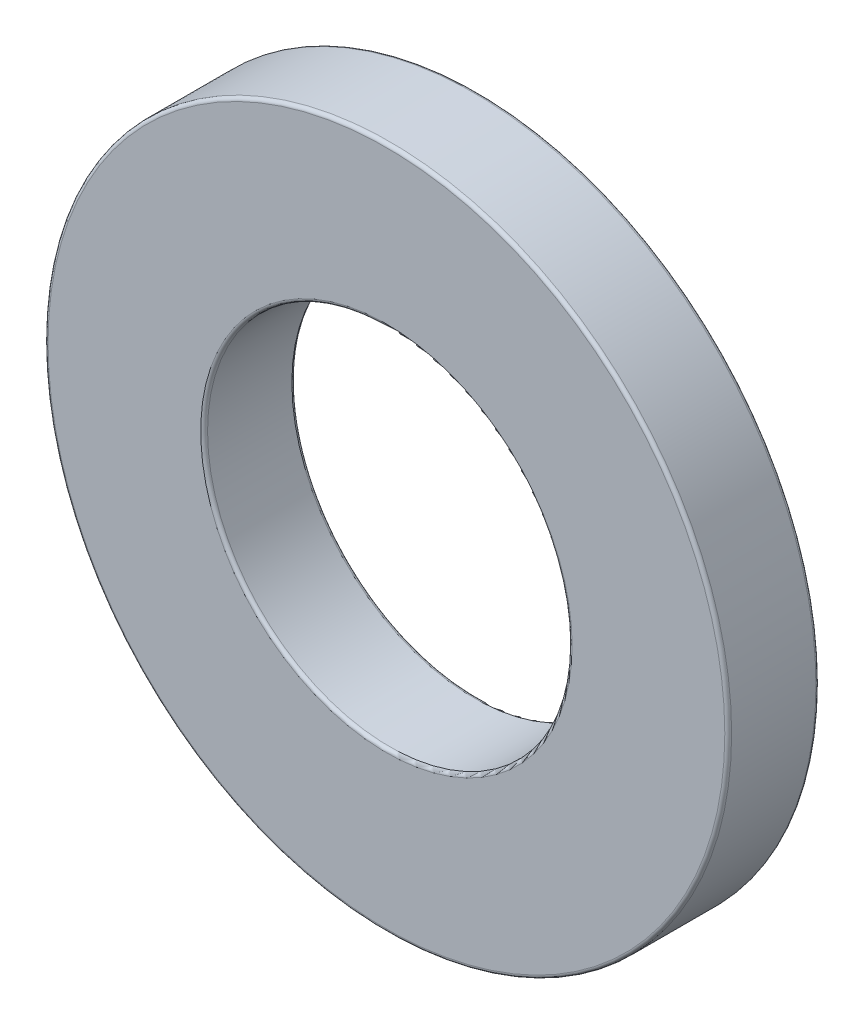
ISO-10303-21;
HEADER;
FILE_DESCRIPTION(('STEP AP214'),'2;1');
FILE_NAME('part.step','',(''),(''),'','','');
FILE_SCHEMA(('AUTOMOTIVE_DESIGN { 1 0 10303 214 1 1 1 1 }'));
ENDSEC;
DATA;
#1=APPLICATION_CONTEXT('core data for automotive mechanical design processes');
#2=APPLICATION_PROTOCOL_DEFINITION('international standard','automotive_design',2000,#1);
#3=PRODUCT_CONTEXT('',#1,'mechanical');
#4=PRODUCT('Part','Part','',(#3));
#5=PRODUCT_RELATED_PRODUCT_CATEGORY('part','',(#4));
#6=PRODUCT_DEFINITION_FORMATION('','',#4);
#7=PRODUCT_DEFINITION_CONTEXT('part definition',#1,'design');
#8=PRODUCT_DEFINITION('design','',#6,#7);
#9=PRODUCT_DEFINITION_SHAPE('','',#8);
#10=(LENGTH_UNIT() NAMED_UNIT(*) SI_UNIT(.MILLI.,.METRE.));
#11=(NAMED_UNIT(*) PLANE_ANGLE_UNIT() SI_UNIT($,.RADIAN.));
#12=(NAMED_UNIT(*) SI_UNIT($,.STERADIAN.) SOLID_ANGLE_UNIT());
#13=UNCERTAINTY_MEASURE_WITH_UNIT(LENGTH_MEASURE(1.E-05),#10,'distance_accuracy_value','');
#14=(GEOMETRIC_REPRESENTATION_CONTEXT(3) GLOBAL_UNCERTAINTY_ASSIGNED_CONTEXT((#13)) GLOBAL_UNIT_ASSIGNED_CONTEXT((#10,
#11,#12)) REPRESENTATION_CONTEXT('',''));
#15=CARTESIAN_POINT('',(0.,0.,0.));
#16=DIRECTION('',(0.,0.,1.));
#17=DIRECTION('',(1.,0.,0.));
#18=AXIS2_PLACEMENT_3D('',#15,#16,#17);
#19=CARTESIAN_POINT('',(0.,0.,-0.799999999999999));
#20=DIRECTION('',(0.,0.,1.));
#21=DIRECTION('',(1.,0.,0.));
#22=AXIS2_PLACEMENT_3D('',#19,#20,#21);
#23=CYLINDRICAL_SURFACE('',#22,6.);
#24=CARTESIAN_POINT('',(0.,0.,0.740000000000001));
#25=DIRECTION('',(0.,0.,1.));
#26=DIRECTION('',(1.,0.,0.));
#27=AXIS2_PLACEMENT_3D('',#24,#25,#26);
#28=CIRCLE('',#27,6.);
#29=CARTESIAN_POINT('',(6.,0.,0.740000000000001));
#30=VERTEX_POINT('',#29);
#31=EDGE_CURVE('E65',#30,#30,#28,.F.);
#32=ORIENTED_EDGE('',*,*,#31,.T.);
#33=EDGE_LOOP('',(#32));
#34=FACE_BOUND('',#33,.T.);
#35=CARTESIAN_POINT('',(0.,0.,-0.739999999999999));
#36=DIRECTION('',(0.,0.,1.));
#37=DIRECTION('',(1.,0.,0.));
#38=AXIS2_PLACEMENT_3D('',#35,#36,#37);
#39=CIRCLE('',#38,6.);
#40=CARTESIAN_POINT('',(6.,0.,-0.739999999999999));
#41=VERTEX_POINT('',#40);
#42=EDGE_CURVE('E69',#41,#41,#39,.T.);
#43=ORIENTED_EDGE('',*,*,#42,.T.);
#44=EDGE_LOOP('',(#43));
#45=FACE_BOUND('',#44,.T.);
#46=ADVANCED_FACE('F39',(#34,#45),#23,.T.);
#47=CARTESIAN_POINT('',(0.,0.,-0.799999999999999));
#48=DIRECTION('',(0.,0.,1.));
#49=DIRECTION('',(1.,0.,0.));
#50=AXIS2_PLACEMENT_3D('',#47,#48,#49);
#51=PLANE('',#50);
#52=CARTESIAN_POINT('',(0.,0.,-0.799999999999999));
#53=DIRECTION('',(0.,0.,1.));
#54=DIRECTION('',(1.,0.,0.));
#55=AXIS2_PLACEMENT_3D('',#52,#53,#54);
#56=CIRCLE('',#55,5.94);
#57=CARTESIAN_POINT('',(5.94,0.,-0.799999999999999));
#58=VERTEX_POINT('',#57);
#59=EDGE_CURVE('E53',#58,#58,#56,.F.);
#60=ORIENTED_EDGE('',*,*,#59,.T.);
#61=EDGE_LOOP('',(#60));
#62=FACE_BOUND('',#61,.T.);
#63=CARTESIAN_POINT('',(0.,0.,-0.799999999999999));
#64=DIRECTION('',(0.,0.,1.));
#65=DIRECTION('',(1.,0.,0.));
#66=AXIS2_PLACEMENT_3D('',#63,#64,#65);
#67=CIRCLE('',#66,3.26);
#68=CARTESIAN_POINT('',(3.26,0.,-0.799999999999999));
#69=VERTEX_POINT('',#68);
#70=EDGE_CURVE('E59',#69,#69,#67,.T.);
#71=ORIENTED_EDGE('',*,*,#70,.T.);
#72=EDGE_LOOP('',(#71));
#73=FACE_BOUND('',#72,.T.);
#74=ADVANCED_FACE('F98',(#62,#73),#51,.F.);
#75=CARTESIAN_POINT('',(0.,0.,0.800000000000001));
#76=DIRECTION('',(0.,0.,1.));
#77=DIRECTION('',(1.,0.,0.));
#78=AXIS2_PLACEMENT_3D('',#75,#76,#77);
#79=PLANE('',#78);
#80=CARTESIAN_POINT('',(0.,0.,0.800000000000001));
#81=DIRECTION('',(0.,0.,1.));
#82=DIRECTION('',(1.,0.,0.));
#83=AXIS2_PLACEMENT_3D('',#80,#81,#82);
#84=CIRCLE('',#83,5.94);
#85=CARTESIAN_POINT('',(5.94,0.,0.800000000000001));
#86=VERTEX_POINT('',#85);
#87=EDGE_CURVE('E73',#86,#86,#84,.T.);
#88=ORIENTED_EDGE('',*,*,#87,.T.);
#89=EDGE_LOOP('',(#88));
#90=FACE_BOUND('',#89,.T.);
#91=CARTESIAN_POINT('',(0.,0.,0.800000000000001));
#92=DIRECTION('',(0.,0.,1.));
#93=DIRECTION('',(1.,0.,0.));
#94=AXIS2_PLACEMENT_3D('',#91,#92,#93);
#95=CIRCLE('',#94,3.26);
#96=CARTESIAN_POINT('',(3.26,0.,0.800000000000001));
#97=VERTEX_POINT('',#96);
#98=EDGE_CURVE('E77',#97,#97,#95,.F.);
#99=ORIENTED_EDGE('',*,*,#98,.T.);
#100=EDGE_LOOP('',(#99));
#101=FACE_BOUND('',#100,.T.);
#102=ADVANCED_FACE('F83',(#90,#101),#79,.T.);
#103=CARTESIAN_POINT('',(0.,0.,-0.799999999999999));
#104=DIRECTION('',(0.,0.,1.));
#105=DIRECTION('',(1.,0.,0.));
#106=AXIS2_PLACEMENT_3D('',#103,#104,#105);
#107=CYLINDRICAL_SURFACE('',#106,3.2);
#108=CARTESIAN_POINT('',(0.,0.,0.740000000000001));
#109=DIRECTION('',(0.,0.,1.));
#110=DIRECTION('',(1.,0.,0.));
#111=AXIS2_PLACEMENT_3D('',#108,#109,#110);
#112=CIRCLE('',#111,3.2);
#113=CARTESIAN_POINT('',(3.2,0.,0.740000000000001));
#114=VERTEX_POINT('',#113);
#115=EDGE_CURVE('E10',#114,#114,#112,.T.);
#116=ORIENTED_EDGE('',*,*,#115,.T.);
#117=EDGE_LOOP('',(#116));
#118=FACE_BOUND('',#117,.T.);
#119=CARTESIAN_POINT('',(0.,0.,-0.739999999999999));
#120=DIRECTION('',(0.,0.,1.));
#121=DIRECTION('',(1.,0.,0.));
#122=AXIS2_PLACEMENT_3D('',#119,#120,#121);
#123=CIRCLE('',#122,3.2);
#124=CARTESIAN_POINT('',(3.2,0.,-0.739999999999999));
#125=VERTEX_POINT('',#124);
#126=EDGE_CURVE('E47',#125,#125,#123,.F.);
#127=ORIENTED_EDGE('',*,*,#126,.T.);
#128=EDGE_LOOP('',(#127));
#129=FACE_BOUND('',#128,.T.);
#130=ADVANCED_FACE('F110',(#118,#129),#107,.F.);
#131=CARTESIAN_POINT('',(0.,0.,0.740000000000001));
#132=DIRECTION('',(0.,0.,1.));
#133=DIRECTION('',(1.,0.,0.));
#134=AXIS2_PLACEMENT_3D('',#131,#132,#133);
#135=TOROIDAL_SURFACE('',#134,5.94,0.06);
#136=ORIENTED_EDGE('',*,*,#31,.F.);
#137=EDGE_LOOP('',(#136));
#138=FACE_BOUND('',#137,.T.);
#139=ORIENTED_EDGE('',*,*,#87,.F.);
#140=EDGE_LOOP('',(#139));
#141=FACE_BOUND('',#140,.T.);
#142=ADVANCED_FACE('F94',(#138,#141),#135,.T.);
#143=CARTESIAN_POINT('',(0.,0.,-0.739999999999999));
#144=DIRECTION('',(0.,0.,1.));
#145=DIRECTION('',(1.,0.,0.));
#146=AXIS2_PLACEMENT_3D('',#143,#144,#145);
#147=TOROIDAL_SURFACE('',#146,5.94,0.06);
#148=ORIENTED_EDGE('',*,*,#59,.F.);
#149=EDGE_LOOP('',(#148));
#150=FACE_BOUND('',#149,.T.);
#151=ORIENTED_EDGE('',*,*,#42,.F.);
#152=EDGE_LOOP('',(#151));
#153=FACE_BOUND('',#152,.T.);
#154=ADVANCED_FACE('F88',(#150,#153),#147,.T.);
#155=CARTESIAN_POINT('',(0.,0.,0.740000000000001));
#156=DIRECTION('',(0.,0.,1.));
#157=DIRECTION('',(1.,0.,0.));
#158=AXIS2_PLACEMENT_3D('',#155,#156,#157);
#159=TOROIDAL_SURFACE('',#158,3.26,0.06);
#160=ORIENTED_EDGE('',*,*,#98,.F.);
#161=EDGE_LOOP('',(#160));
#162=FACE_BOUND('',#161,.T.);
#163=ORIENTED_EDGE('',*,*,#115,.F.);
#164=EDGE_LOOP('',(#163));
#165=FACE_BOUND('',#164,.T.);
#166=ADVANCED_FACE('F85',(#162,#165),#159,.T.);
#167=CARTESIAN_POINT('',(0.,0.,-0.739999999999999));
#168=DIRECTION('',(0.,0.,1.));
#169=DIRECTION('',(1.,0.,0.));
#170=AXIS2_PLACEMENT_3D('',#167,#168,#169);
#171=TOROIDAL_SURFACE('',#170,3.26,0.06);
#172=ORIENTED_EDGE('',*,*,#126,.F.);
#173=EDGE_LOOP('',(#172));
#174=FACE_BOUND('',#173,.T.);
#175=ORIENTED_EDGE('',*,*,#70,.F.);
#176=EDGE_LOOP('',(#175));
#177=FACE_BOUND('',#176,.T.);
#178=ADVANCED_FACE('F41',(#174,#177),#171,.T.);
#179=CLOSED_SHELL('',(#46,#74,#102,#130,#142,#154,#166,#178));
#180=MANIFOLD_SOLID_BREP('B2',#179);
#181=ADVANCED_BREP_SHAPE_REPRESENTATION('',(#18,#180),#14);
#182=SHAPE_DEFINITION_REPRESENTATION(#9,#181);
ENDSEC;
END-ISO-10303-21;
